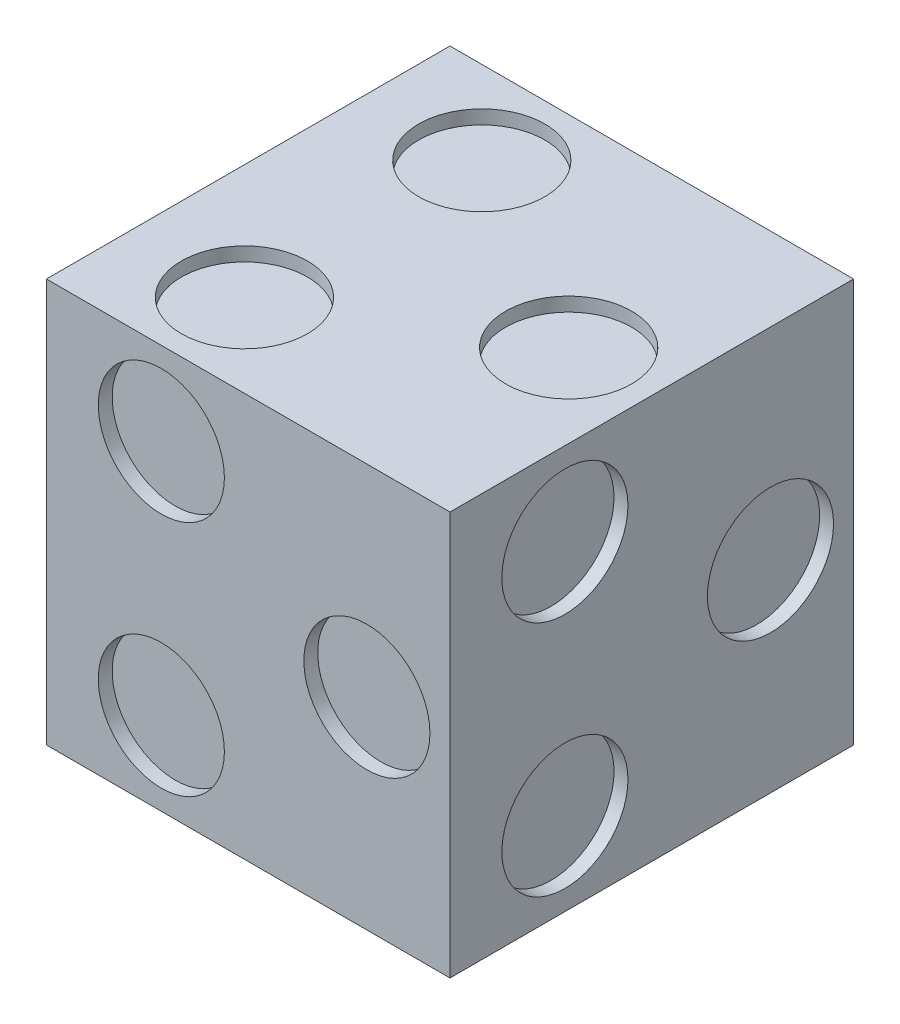
ISO-10303-21;
HEADER;
FILE_DESCRIPTION(('STEP AP214'),'2;1');
FILE_NAME('part.step','',(''),(''),'','','');
FILE_SCHEMA(('AUTOMOTIVE_DESIGN { 1 0 10303 214 1 1 1 1 }'));
ENDSEC;
DATA;
#1=APPLICATION_CONTEXT('core data for automotive mechanical design processes');
#2=APPLICATION_PROTOCOL_DEFINITION('international standard','automotive_design',2000,#1);
#3=PRODUCT_CONTEXT('',#1,'mechanical');
#4=PRODUCT('Part','Part','',(#3));
#5=PRODUCT_RELATED_PRODUCT_CATEGORY('part','',(#4));
#6=PRODUCT_DEFINITION_FORMATION('','',#4);
#7=PRODUCT_DEFINITION_CONTEXT('part definition',#1,'design');
#8=PRODUCT_DEFINITION('design','',#6,#7);
#9=PRODUCT_DEFINITION_SHAPE('','',#8);
#10=(LENGTH_UNIT() NAMED_UNIT(*) SI_UNIT(.MILLI.,.METRE.));
#11=(NAMED_UNIT(*) PLANE_ANGLE_UNIT() SI_UNIT($,.RADIAN.));
#12=(NAMED_UNIT(*) SI_UNIT($,.STERADIAN.) SOLID_ANGLE_UNIT());
#13=UNCERTAINTY_MEASURE_WITH_UNIT(LENGTH_MEASURE(1.E-05),#10,'distance_accuracy_value','');
#14=(GEOMETRIC_REPRESENTATION_CONTEXT(3) GLOBAL_UNCERTAINTY_ASSIGNED_CONTEXT((#13)) GLOBAL_UNIT_ASSIGNED_CONTEXT((#10,
#11,#12)) REPRESENTATION_CONTEXT('',''));
#15=CARTESIAN_POINT('',(0.,0.,0.));
#16=DIRECTION('',(0.,0.,1.));
#17=DIRECTION('',(1.,0.,0.));
#18=AXIS2_PLACEMENT_3D('',#15,#16,#17);
#19=CARTESIAN_POINT('',(0.,101.6,0.));
#20=DIRECTION('',(1.,0.,0.));
#21=DIRECTION('',(0.,0.,-1.));
#22=AXIS2_PLACEMENT_3D('',#19,#20,#21);
#23=PLANE('',#22);
#24=CARTESIAN_POINT('',(0.,50.8,-20.9221235694369));
#25=DIRECTION('',(-1.,0.,0.));
#26=DIRECTION('',(0.,0.,1.));
#27=AXIS2_PLACEMENT_3D('',#24,#25,#26);
#28=CIRCLE('',#27,15.875);
#29=CARTESIAN_POINT('',(0.,50.8,-5.04712356943687));
#30=VERTEX_POINT('',#29);
#31=EDGE_CURVE('E138',#30,#30,#28,.T.);
#32=ORIENTED_EDGE('',*,*,#31,.F.);
#33=EDGE_LOOP('',(#32));
#34=FACE_BOUND('',#33,.T.);
#35=CARTESIAN_POINT('',(0.,80.6778764305631,-72.6721235694368));
#36=DIRECTION('',(-1.,0.,0.));
#37=DIRECTION('',(0.,0.,1.));
#38=AXIS2_PLACEMENT_3D('',#35,#36,#37);
#39=CIRCLE('',#38,15.875);
#40=CARTESIAN_POINT('',(0.,80.6778764305631,-56.7971235694369));
#41=VERTEX_POINT('',#40);
#42=EDGE_CURVE('E145',#41,#41,#39,.T.);
#43=ORIENTED_EDGE('',*,*,#42,.F.);
#44=EDGE_LOOP('',(#43));
#45=FACE_BOUND('',#44,.T.);
#46=CARTESIAN_POINT('',(0.,20.9221235694369,-72.6721235694369));
#47=DIRECTION('',(-1.,0.,0.));
#48=DIRECTION('',(0.,0.,1.));
#49=AXIS2_PLACEMENT_3D('',#46,#47,#48);
#50=CIRCLE('',#49,15.875);
#51=CARTESIAN_POINT('',(0.,20.9221235694369,-56.7971235694369));
#52=VERTEX_POINT('',#51);
#53=EDGE_CURVE('E132',#52,#52,#50,.T.);
#54=ORIENTED_EDGE('',*,*,#53,.F.);
#55=EDGE_LOOP('',(#54));
#56=FACE_BOUND('',#55,.T.);
#57=DIRECTION('',(0.,0.,1.));
#58=VECTOR('',#57,1.);
#59=CARTESIAN_POINT('',(0.,0.,0.));
#60=LINE('',#59,#58);
#61=CARTESIAN_POINT('',(0.,0.,-101.6));
#62=VERTEX_POINT('',#61);
#63=CARTESIAN_POINT('',(0.,0.,0.));
#64=VERTEX_POINT('',#63);
#65=EDGE_CURVE('E100',#62,#64,#60,.T.);
#66=ORIENTED_EDGE('',*,*,#65,.T.);
#67=DIRECTION('',(0.,-1.,0.));
#68=VECTOR('',#67,1.);
#69=CARTESIAN_POINT('',(0.,101.6,0.));
#70=LINE('',#69,#68);
#71=CARTESIAN_POINT('',(0.,101.6,0.));
#72=VERTEX_POINT('',#71);
#73=EDGE_CURVE('E11',#72,#64,#70,.T.);
#74=ORIENTED_EDGE('',*,*,#73,.F.);
#75=DIRECTION('',(0.,0.,1.));
#76=VECTOR('',#75,1.);
#77=CARTESIAN_POINT('',(0.,101.6,0.));
#78=LINE('',#77,#76);
#79=CARTESIAN_POINT('',(0.,101.6,-101.6));
#80=VERTEX_POINT('',#79);
#81=EDGE_CURVE('E88',#80,#72,#78,.T.);
#82=ORIENTED_EDGE('',*,*,#81,.F.);
#83=DIRECTION('',(0.,-1.,0.));
#84=VECTOR('',#83,1.);
#85=CARTESIAN_POINT('',(0.,101.6,-101.6));
#86=LINE('',#85,#84);
#87=EDGE_CURVE('E96',#80,#62,#86,.T.);
#88=ORIENTED_EDGE('',*,*,#87,.T.);
#89=EDGE_LOOP('',(#66,#74,#82,#88));
#90=FACE_BOUND('',#89,.T.);
#91=ADVANCED_FACE('F37',(#34,#45,#56,#90),#23,.F.);
#92=CARTESIAN_POINT('',(0.,101.6,0.));
#93=DIRECTION('',(0.,0.,-1.));
#94=DIRECTION('',(-1.,0.,0.));
#95=AXIS2_PLACEMENT_3D('',#92,#93,#94);
#96=PLANE('',#95);
#97=CARTESIAN_POINT('',(80.6778764305631,50.8,0.));
#98=DIRECTION('',(0.,0.,1.));
#99=DIRECTION('',(1.,0.,0.));
#100=AXIS2_PLACEMENT_3D('',#97,#98,#99);
#101=CIRCLE('',#100,15.875);
#102=CARTESIAN_POINT('',(96.5528764305631,50.8,0.));
#103=VERTEX_POINT('',#102);
#104=EDGE_CURVE('E192',#103,#103,#101,.T.);
#105=ORIENTED_EDGE('',*,*,#104,.F.);
#106=EDGE_LOOP('',(#105));
#107=FACE_BOUND('',#106,.T.);
#108=CARTESIAN_POINT('',(28.9278764305631,80.6778764305631,0.));
#109=DIRECTION('',(0.,0.,1.));
#110=DIRECTION('',(1.,0.,0.));
#111=AXIS2_PLACEMENT_3D('',#108,#109,#110);
#112=CIRCLE('',#111,15.875);
#113=CARTESIAN_POINT('',(44.8028764305631,80.6778764305631,0.));
#114=VERTEX_POINT('',#113);
#115=EDGE_CURVE('E199',#114,#114,#112,.T.);
#116=ORIENTED_EDGE('',*,*,#115,.F.);
#117=EDGE_LOOP('',(#116));
#118=FACE_BOUND('',#117,.T.);
#119=CARTESIAN_POINT('',(28.9278764305631,20.9221235694368,0.));
#120=DIRECTION('',(0.,0.,1.));
#121=DIRECTION('',(1.,0.,0.));
#122=AXIS2_PLACEMENT_3D('',#119,#120,#121);
#123=CIRCLE('',#122,15.875);
#124=CARTESIAN_POINT('',(44.8028764305631,20.9221235694368,0.));
#125=VERTEX_POINT('',#124);
#126=EDGE_CURVE('E186',#125,#125,#123,.T.);
#127=ORIENTED_EDGE('',*,*,#126,.F.);
#128=EDGE_LOOP('',(#127));
#129=FACE_BOUND('',#128,.T.);
#130=DIRECTION('',(1.,0.,0.));
#131=VECTOR('',#130,1.);
#132=CARTESIAN_POINT('',(0.,0.,0.));
#133=LINE('',#132,#131);
#134=CARTESIAN_POINT('',(101.6,0.,0.));
#135=VERTEX_POINT('',#134);
#136=EDGE_CURVE('E92',#64,#135,#133,.T.);
#137=ORIENTED_EDGE('',*,*,#136,.T.);
#138=DIRECTION('',(0.,-1.,0.));
#139=VECTOR('',#138,1.);
#140=CARTESIAN_POINT('',(101.6,101.6,0.));
#141=LINE('',#140,#139);
#142=CARTESIAN_POINT('',(101.6,101.6,0.));
#143=VERTEX_POINT('',#142);
#144=EDGE_CURVE('E45',#143,#135,#141,.T.);
#145=ORIENTED_EDGE('',*,*,#144,.F.);
#146=DIRECTION('',(1.,0.,0.));
#147=VECTOR('',#146,1.);
#148=CARTESIAN_POINT('',(0.,101.6,0.));
#149=LINE('',#148,#147);
#150=EDGE_CURVE('E83',#72,#143,#149,.T.);
#151=ORIENTED_EDGE('',*,*,#150,.F.);
#152=ORIENTED_EDGE('',*,*,#73,.T.);
#153=EDGE_LOOP('',(#137,#145,#151,#152));
#154=FACE_BOUND('',#153,.T.);
#155=ADVANCED_FACE('F91',(#107,#118,#129,#154),#96,.F.);
#156=CARTESIAN_POINT('',(101.6,101.6,0.));
#157=DIRECTION('',(-1.,0.,0.));
#158=DIRECTION('',(0.,0.,1.));
#159=AXIS2_PLACEMENT_3D('',#156,#157,#158);
#160=PLANE('',#159);
#161=CARTESIAN_POINT('',(101.6,50.8,-80.6778764305631));
#162=DIRECTION('',(1.,0.,0.));
#163=DIRECTION('',(0.,0.,-1.));
#164=AXIS2_PLACEMENT_3D('',#161,#162,#163);
#165=CIRCLE('',#164,15.875);
#166=CARTESIAN_POINT('',(101.6,50.8,-96.5528764305631));
#167=VERTEX_POINT('',#166);
#168=EDGE_CURVE('E174',#167,#167,#165,.T.);
#169=ORIENTED_EDGE('',*,*,#168,.F.);
#170=EDGE_LOOP('',(#169));
#171=FACE_BOUND('',#170,.T.);
#172=CARTESIAN_POINT('',(101.6,80.6778764305631,-28.9278764305631));
#173=DIRECTION('',(1.,0.,0.));
#174=DIRECTION('',(0.,0.,-1.));
#175=AXIS2_PLACEMENT_3D('',#172,#173,#174);
#176=CIRCLE('',#175,15.875);
#177=CARTESIAN_POINT('',(101.6,80.6778764305631,-44.8028764305632));
#178=VERTEX_POINT('',#177);
#179=EDGE_CURVE('E181',#178,#178,#176,.T.);
#180=ORIENTED_EDGE('',*,*,#179,.F.);
#181=EDGE_LOOP('',(#180));
#182=FACE_BOUND('',#181,.T.);
#183=CARTESIAN_POINT('',(101.6,20.9221235694369,-28.9278764305631));
#184=DIRECTION('',(1.,0.,0.));
#185=DIRECTION('',(0.,0.,-1.));
#186=AXIS2_PLACEMENT_3D('',#183,#184,#185);
#187=CIRCLE('',#186,15.875);
#188=CARTESIAN_POINT('',(101.6,20.9221235694369,-44.8028764305632));
#189=VERTEX_POINT('',#188);
#190=EDGE_CURVE('E168',#189,#189,#187,.T.);
#191=ORIENTED_EDGE('',*,*,#190,.F.);
#192=EDGE_LOOP('',(#191));
#193=FACE_BOUND('',#192,.T.);
#194=DIRECTION('',(0.,0.,-1.));
#195=VECTOR('',#194,1.);
#196=CARTESIAN_POINT('',(101.6,0.,0.));
#197=LINE('',#196,#195);
#198=CARTESIAN_POINT('',(101.6,0.,-101.6));
#199=VERTEX_POINT('',#198);
#200=EDGE_CURVE('E70',#135,#199,#197,.T.);
#201=ORIENTED_EDGE('',*,*,#200,.T.);
#202=DIRECTION('',(0.,-1.,0.));
#203=VECTOR('',#202,1.);
#204=CARTESIAN_POINT('',(101.6,101.6,-101.6));
#205=LINE('',#204,#203);
#206=CARTESIAN_POINT('',(101.6,101.6,-101.6));
#207=VERTEX_POINT('',#206);
#208=EDGE_CURVE('E93',#207,#199,#205,.T.);
#209=ORIENTED_EDGE('',*,*,#208,.F.);
#210=DIRECTION('',(0.,0.,-1.));
#211=VECTOR('',#210,1.);
#212=CARTESIAN_POINT('',(101.6,101.6,0.));
#213=LINE('',#212,#211);
#214=EDGE_CURVE('E86',#143,#207,#213,.T.);
#215=ORIENTED_EDGE('',*,*,#214,.F.);
#216=ORIENTED_EDGE('',*,*,#144,.T.);
#217=EDGE_LOOP('',(#201,#209,#215,#216));
#218=FACE_BOUND('',#217,.T.);
#219=ADVANCED_FACE('F94',(#171,#182,#193,#218),#160,.F.);
#220=CARTESIAN_POINT('',(0.,101.6,-101.6));
#221=DIRECTION('',(0.,0.,1.));
#222=DIRECTION('',(1.,0.,0.));
#223=AXIS2_PLACEMENT_3D('',#220,#221,#222);
#224=PLANE('',#223);
#225=CARTESIAN_POINT('',(20.9221235694369,50.8,-101.6));
#226=DIRECTION('',(0.,0.,-1.));
#227=DIRECTION('',(-1.,0.,0.));
#228=AXIS2_PLACEMENT_3D('',#225,#226,#227);
#229=CIRCLE('',#228,15.875);
#230=CARTESIAN_POINT('',(5.04712356943688,50.8,-101.6));
#231=VERTEX_POINT('',#230);
#232=EDGE_CURVE('E156',#231,#231,#229,.T.);
#233=ORIENTED_EDGE('',*,*,#232,.F.);
#234=EDGE_LOOP('',(#233));
#235=FACE_BOUND('',#234,.T.);
#236=CARTESIAN_POINT('',(72.6721235694369,80.6778764305631,-101.6));
#237=DIRECTION('',(0.,0.,-1.));
#238=DIRECTION('',(-1.,0.,0.));
#239=AXIS2_PLACEMENT_3D('',#236,#237,#238);
#240=CIRCLE('',#239,15.875);
#241=CARTESIAN_POINT('',(56.7971235694369,80.6778764305631,-101.6));
#242=VERTEX_POINT('',#241);
#243=EDGE_CURVE('E163',#242,#242,#240,.T.);
#244=ORIENTED_EDGE('',*,*,#243,.F.);
#245=EDGE_LOOP('',(#244));
#246=FACE_BOUND('',#245,.T.);
#247=CARTESIAN_POINT('',(72.6721235694369,20.9221235694369,-101.6));
#248=DIRECTION('',(0.,0.,-1.));
#249=DIRECTION('',(-1.,0.,0.));
#250=AXIS2_PLACEMENT_3D('',#247,#248,#249);
#251=CIRCLE('',#250,15.875);
#252=CARTESIAN_POINT('',(56.7971235694369,20.9221235694369,-101.6));
#253=VERTEX_POINT('',#252);
#254=EDGE_CURVE('E150',#253,#253,#251,.T.);
#255=ORIENTED_EDGE('',*,*,#254,.F.);
#256=EDGE_LOOP('',(#255));
#257=FACE_BOUND('',#256,.T.);
#258=DIRECTION('',(-1.,0.,0.));
#259=VECTOR('',#258,1.);
#260=CARTESIAN_POINT('',(0.,0.,-101.6));
#261=LINE('',#260,#259);
#262=EDGE_CURVE('E76',#199,#62,#261,.T.);
#263=ORIENTED_EDGE('',*,*,#262,.T.);
#264=ORIENTED_EDGE('',*,*,#87,.F.);
#265=DIRECTION('',(-1.,0.,0.));
#266=VECTOR('',#265,1.);
#267=CARTESIAN_POINT('',(0.,101.6,-101.6));
#268=LINE('',#267,#266);
#269=EDGE_CURVE('E53',#207,#80,#268,.T.);
#270=ORIENTED_EDGE('',*,*,#269,.F.);
#271=ORIENTED_EDGE('',*,*,#208,.T.);
#272=EDGE_LOOP('',(#263,#264,#270,#271));
#273=FACE_BOUND('',#272,.T.);
#274=ADVANCED_FACE('F108',(#235,#246,#257,#273),#224,.F.);
#275=CARTESIAN_POINT('',(0.,101.6,0.));
#276=DIRECTION('',(0.,-1.,0.));
#277=DIRECTION('',(0.,0.,-1.));
#278=AXIS2_PLACEMENT_3D('',#275,#276,#277);
#279=PLANE('',#278);
#280=CARTESIAN_POINT('',(80.6778764305631,101.6,-50.8));
#281=DIRECTION('',(0.,1.,0.));
#282=DIRECTION('',(0.,0.,1.));
#283=AXIS2_PLACEMENT_3D('',#280,#281,#282);
#284=CIRCLE('',#283,15.875);
#285=CARTESIAN_POINT('',(80.6778764305631,101.6,-34.925));
#286=VERTEX_POINT('',#285);
#287=EDGE_CURVE('E120',#286,#286,#284,.T.);
#288=ORIENTED_EDGE('',*,*,#287,.F.);
#289=EDGE_LOOP('',(#288));
#290=FACE_BOUND('',#289,.T.);
#291=CARTESIAN_POINT('',(28.9278764305631,101.6,-80.6778764305631));
#292=DIRECTION('',(0.,1.,0.));
#293=DIRECTION('',(0.,0.,1.));
#294=AXIS2_PLACEMENT_3D('',#291,#292,#293);
#295=CIRCLE('',#294,15.875);
#296=CARTESIAN_POINT('',(28.9278764305631,101.6,-64.8028764305631));
#297=VERTEX_POINT('',#296);
#298=EDGE_CURVE('E127',#297,#297,#295,.T.);
#299=ORIENTED_EDGE('',*,*,#298,.F.);
#300=EDGE_LOOP('',(#299));
#301=FACE_BOUND('',#300,.T.);
#302=CARTESIAN_POINT('',(28.9278764305631,101.6,-20.9221235694369));
#303=DIRECTION('',(0.,1.,0.));
#304=DIRECTION('',(0.,0.,1.));
#305=AXIS2_PLACEMENT_3D('',#302,#303,#304);
#306=CIRCLE('',#305,15.875);
#307=CARTESIAN_POINT('',(28.9278764305631,101.6,-5.04712356943686));
#308=VERTEX_POINT('',#307);
#309=EDGE_CURVE('E114',#308,#308,#306,.T.);
#310=ORIENTED_EDGE('',*,*,#309,.F.);
#311=EDGE_LOOP('',(#310));
#312=FACE_BOUND('',#311,.T.);
#313=ORIENTED_EDGE('',*,*,#81,.T.);
#314=ORIENTED_EDGE('',*,*,#150,.T.);
#315=ORIENTED_EDGE('',*,*,#214,.T.);
#316=ORIENTED_EDGE('',*,*,#269,.T.);
#317=EDGE_LOOP('',(#313,#314,#315,#316));
#318=FACE_BOUND('',#317,.T.);
#319=ADVANCED_FACE('F84',(#290,#301,#312,#318),#279,.F.);
#320=CARTESIAN_POINT('',(0.,0.,0.));
#321=DIRECTION('',(0.,-1.,0.));
#322=DIRECTION('',(0.,0.,-1.));
#323=AXIS2_PLACEMENT_3D('',#320,#321,#322);
#324=PLANE('',#323);
#325=CARTESIAN_POINT('',(20.9221235694369,0.,-50.8));
#326=DIRECTION('',(0.,-1.,0.));
#327=DIRECTION('',(0.,0.,-1.));
#328=AXIS2_PLACEMENT_3D('',#325,#326,#327);
#329=CIRCLE('',#328,15.875);
#330=CARTESIAN_POINT('',(20.9221235694369,0.,-66.675));
#331=VERTEX_POINT('',#330);
#332=EDGE_CURVE('E210',#331,#331,#329,.T.);
#333=ORIENTED_EDGE('',*,*,#332,.F.);
#334=EDGE_LOOP('',(#333));
#335=FACE_BOUND('',#334,.T.);
#336=CARTESIAN_POINT('',(72.6721235694369,0.,-80.6778764305631));
#337=DIRECTION('',(0.,-1.,0.));
#338=DIRECTION('',(0.,0.,-1.));
#339=AXIS2_PLACEMENT_3D('',#336,#337,#338);
#340=CIRCLE('',#339,15.875);
#341=CARTESIAN_POINT('',(72.6721235694369,0.,-96.5528764305631));
#342=VERTEX_POINT('',#341);
#343=EDGE_CURVE('E216',#342,#342,#340,.T.);
#344=ORIENTED_EDGE('',*,*,#343,.F.);
#345=EDGE_LOOP('',(#344));
#346=FACE_BOUND('',#345,.T.);
#347=CARTESIAN_POINT('',(72.6721235694369,0.,-20.9221235694369));
#348=DIRECTION('',(0.,-1.,0.));
#349=DIRECTION('',(0.,0.,-1.));
#350=AXIS2_PLACEMENT_3D('',#347,#348,#349);
#351=CIRCLE('',#350,15.875);
#352=CARTESIAN_POINT('',(72.6721235694369,0.,-36.7971235694369));
#353=VERTEX_POINT('',#352);
#354=EDGE_CURVE('E204',#353,#353,#351,.T.);
#355=ORIENTED_EDGE('',*,*,#354,.F.);
#356=EDGE_LOOP('',(#355));
#357=FACE_BOUND('',#356,.T.);
#358=ORIENTED_EDGE('',*,*,#65,.F.);
#359=ORIENTED_EDGE('',*,*,#262,.F.);
#360=ORIENTED_EDGE('',*,*,#200,.F.);
#361=ORIENTED_EDGE('',*,*,#136,.F.);
#362=EDGE_LOOP('',(#358,#359,#360,#361));
#363=FACE_BOUND('',#362,.T.);
#364=ADVANCED_FACE('F111',(#335,#346,#357,#363),#324,.T.);
#365=CARTESIAN_POINT('',(28.9278764305631,98.099999888,-20.9221235694369));
#366=DIRECTION('',(0.,1.,0.));
#367=DIRECTION('',(0.,0.,1.));
#368=AXIS2_PLACEMENT_3D('',#365,#366,#367);
#369=CYLINDRICAL_SURFACE('',#368,15.875);
#370=CARTESIAN_POINT('',(28.9278764305631,98.099999888,-20.9221235694369));
#371=DIRECTION('',(0.,1.,0.));
#372=DIRECTION('',(0.,0.,1.));
#373=AXIS2_PLACEMENT_3D('',#370,#371,#372);
#374=CIRCLE('',#373,15.875);
#375=CARTESIAN_POINT('',(28.9278764305631,98.099999888,-5.04712356943686));
#376=VERTEX_POINT('',#375);
#377=EDGE_CURVE('E103',#376,#376,#374,.T.);
#378=ORIENTED_EDGE('',*,*,#377,.F.);
#379=EDGE_LOOP('',(#378));
#380=FACE_BOUND('',#379,.T.);
#381=ORIENTED_EDGE('',*,*,#309,.T.);
#382=EDGE_LOOP('',(#381));
#383=FACE_BOUND('',#382,.T.);
#384=ADVANCED_FACE('F233',(#380,#383),#369,.F.);
#385=CARTESIAN_POINT('',(28.9278764305631,98.099999888,-20.9221235694369));
#386=DIRECTION('',(0.,1.,0.));
#387=DIRECTION('',(0.,0.,1.));
#388=AXIS2_PLACEMENT_3D('',#385,#386,#387);
#389=PLANE('',#388);
#390=ORIENTED_EDGE('',*,*,#377,.T.);
#391=EDGE_LOOP('',(#390));
#392=FACE_BOUND('',#391,.T.);
#393=ADVANCED_FACE('F291',(#392),#389,.T.);
#394=CARTESIAN_POINT('',(28.9278764305631,98.099999888,-80.6778764305631));
#395=DIRECTION('',(0.,1.,0.));
#396=DIRECTION('',(0.,0.,1.));
#397=AXIS2_PLACEMENT_3D('',#394,#395,#396);
#398=CYLINDRICAL_SURFACE('',#397,15.875);
#399=CARTESIAN_POINT('',(28.9278764305631,98.099999888,-80.6778764305631));
#400=DIRECTION('',(0.,1.,0.));
#401=DIRECTION('',(0.,0.,1.));
#402=AXIS2_PLACEMENT_3D('',#399,#400,#401);
#403=CIRCLE('',#402,15.875);
#404=CARTESIAN_POINT('',(28.9278764305631,98.099999888,-64.8028764305631));
#405=VERTEX_POINT('',#404);
#406=EDGE_CURVE('E117',#405,#405,#403,.T.);
#407=ORIENTED_EDGE('',*,*,#406,.F.);
#408=EDGE_LOOP('',(#407));
#409=FACE_BOUND('',#408,.T.);
#410=ORIENTED_EDGE('',*,*,#298,.T.);
#411=EDGE_LOOP('',(#410));
#412=FACE_BOUND('',#411,.T.);
#413=ADVANCED_FACE('F288',(#409,#412),#398,.F.);
#414=CARTESIAN_POINT('',(28.9278764305631,98.099999888,-80.6778764305631));
#415=DIRECTION('',(0.,1.,0.));
#416=DIRECTION('',(0.,0.,1.));
#417=AXIS2_PLACEMENT_3D('',#414,#415,#416);
#418=PLANE('',#417);
#419=ORIENTED_EDGE('',*,*,#406,.T.);
#420=EDGE_LOOP('',(#419));
#421=FACE_BOUND('',#420,.T.);
#422=ADVANCED_FACE('F285',(#421),#418,.T.);
#423=CARTESIAN_POINT('',(80.6778764305631,98.099999888,-50.8));
#424=DIRECTION('',(0.,1.,0.));
#425=DIRECTION('',(0.,0.,1.));
#426=AXIS2_PLACEMENT_3D('',#423,#424,#425);
#427=CYLINDRICAL_SURFACE('',#426,15.875);
#428=CARTESIAN_POINT('',(80.6778764305631,98.099999888,-50.8));
#429=DIRECTION('',(0.,1.,0.));
#430=DIRECTION('',(0.,0.,1.));
#431=AXIS2_PLACEMENT_3D('',#428,#429,#430);
#432=CIRCLE('',#431,15.875);
#433=CARTESIAN_POINT('',(80.6778764305631,98.099999888,-34.925));
#434=VERTEX_POINT('',#433);
#435=EDGE_CURVE('E123',#434,#434,#432,.T.);
#436=ORIENTED_EDGE('',*,*,#435,.F.);
#437=EDGE_LOOP('',(#436));
#438=FACE_BOUND('',#437,.T.);
#439=ORIENTED_EDGE('',*,*,#287,.T.);
#440=EDGE_LOOP('',(#439));
#441=FACE_BOUND('',#440,.T.);
#442=ADVANCED_FACE('F279',(#438,#441),#427,.F.);
#443=CARTESIAN_POINT('',(80.6778764305631,98.099999888,-50.8));
#444=DIRECTION('',(0.,1.,0.));
#445=DIRECTION('',(0.,0.,1.));
#446=AXIS2_PLACEMENT_3D('',#443,#444,#445);
#447=PLANE('',#446);
#448=ORIENTED_EDGE('',*,*,#435,.T.);
#449=EDGE_LOOP('',(#448));
#450=FACE_BOUND('',#449,.T.);
#451=ADVANCED_FACE('F269',(#450),#447,.T.);
#452=CARTESIAN_POINT('',(3.500000112,20.9221235694369,-72.6721235694369));
#453=DIRECTION('',(-1.,0.,0.));
#454=DIRECTION('',(0.,0.,1.));
#455=AXIS2_PLACEMENT_3D('',#452,#453,#454);
#456=CYLINDRICAL_SURFACE('',#455,15.875);
#457=CARTESIAN_POINT('',(3.500000112,20.9221235694369,-72.6721235694369));
#458=DIRECTION('',(-1.,0.,0.));
#459=DIRECTION('',(0.,0.,1.));
#460=AXIS2_PLACEMENT_3D('',#457,#458,#459);
#461=CIRCLE('',#460,15.875);
#462=CARTESIAN_POINT('',(3.500000112,20.9221235694369,-56.7971235694369));
#463=VERTEX_POINT('',#462);
#464=EDGE_CURVE('E124',#463,#463,#461,.T.);
#465=ORIENTED_EDGE('',*,*,#464,.F.);
#466=EDGE_LOOP('',(#465));
#467=FACE_BOUND('',#466,.T.);
#468=ORIENTED_EDGE('',*,*,#53,.T.);
#469=EDGE_LOOP('',(#468));
#470=FACE_BOUND('',#469,.T.);
#471=ADVANCED_FACE('F266',(#467,#470),#456,.F.);
#472=CARTESIAN_POINT('',(3.500000112,20.9221235694369,-72.6721235694369));
#473=DIRECTION('',(-1.,0.,0.));
#474=DIRECTION('',(0.,0.,1.));
#475=AXIS2_PLACEMENT_3D('',#472,#473,#474);
#476=PLANE('',#475);
#477=ORIENTED_EDGE('',*,*,#464,.T.);
#478=EDGE_LOOP('',(#477));
#479=FACE_BOUND('',#478,.T.);
#480=ADVANCED_FACE('F268',(#479),#476,.T.);
#481=CARTESIAN_POINT('',(3.500000112,80.6778764305631,-72.6721235694368));
#482=DIRECTION('',(-1.,0.,0.));
#483=DIRECTION('',(0.,0.,1.));
#484=AXIS2_PLACEMENT_3D('',#481,#482,#483);
#485=CYLINDRICAL_SURFACE('',#484,15.875);
#486=CARTESIAN_POINT('',(3.500000112,80.6778764305631,-72.6721235694368));
#487=DIRECTION('',(-1.,0.,0.));
#488=DIRECTION('',(0.,0.,1.));
#489=AXIS2_PLACEMENT_3D('',#486,#487,#488);
#490=CIRCLE('',#489,15.875);
#491=CARTESIAN_POINT('',(3.500000112,80.6778764305631,-56.7971235694369));
#492=VERTEX_POINT('',#491);
#493=EDGE_CURVE('E135',#492,#492,#490,.T.);
#494=ORIENTED_EDGE('',*,*,#493,.F.);
#495=EDGE_LOOP('',(#494));
#496=FACE_BOUND('',#495,.T.);
#497=ORIENTED_EDGE('',*,*,#42,.T.);
#498=EDGE_LOOP('',(#497));
#499=FACE_BOUND('',#498,.T.);
#500=ADVANCED_FACE('F276',(#496,#499),#485,.F.);
#501=CARTESIAN_POINT('',(3.500000112,80.6778764305631,-72.6721235694368));
#502=DIRECTION('',(-1.,0.,0.));
#503=DIRECTION('',(0.,0.,1.));
#504=AXIS2_PLACEMENT_3D('',#501,#502,#503);
#505=PLANE('',#504);
#506=ORIENTED_EDGE('',*,*,#493,.T.);
#507=EDGE_LOOP('',(#506));
#508=FACE_BOUND('',#507,.T.);
#509=ADVANCED_FACE('F358',(#508),#505,.T.);
#510=CARTESIAN_POINT('',(3.500000112,50.8,-20.9221235694369));
#511=DIRECTION('',(-1.,0.,0.));
#512=DIRECTION('',(0.,0.,1.));
#513=AXIS2_PLACEMENT_3D('',#510,#511,#512);
#514=CYLINDRICAL_SURFACE('',#513,15.875);
#515=CARTESIAN_POINT('',(3.500000112,50.8,-20.9221235694369));
#516=DIRECTION('',(-1.,0.,0.));
#517=DIRECTION('',(0.,0.,1.));
#518=AXIS2_PLACEMENT_3D('',#515,#516,#517);
#519=CIRCLE('',#518,15.875);
#520=CARTESIAN_POINT('',(3.500000112,50.8,-5.04712356943687));
#521=VERTEX_POINT('',#520);
#522=EDGE_CURVE('E141',#521,#521,#519,.T.);
#523=ORIENTED_EDGE('',*,*,#522,.F.);
#524=EDGE_LOOP('',(#523));
#525=FACE_BOUND('',#524,.T.);
#526=ORIENTED_EDGE('',*,*,#31,.T.);
#527=EDGE_LOOP('',(#526));
#528=FACE_BOUND('',#527,.T.);
#529=ADVANCED_FACE('F361',(#525,#528),#514,.F.);
#530=CARTESIAN_POINT('',(3.500000112,50.8,-20.9221235694369));
#531=DIRECTION('',(-1.,0.,0.));
#532=DIRECTION('',(0.,0.,1.));
#533=AXIS2_PLACEMENT_3D('',#530,#531,#532);
#534=PLANE('',#533);
#535=ORIENTED_EDGE('',*,*,#522,.T.);
#536=EDGE_LOOP('',(#535));
#537=FACE_BOUND('',#536,.T.);
#538=ADVANCED_FACE('F356',(#537),#534,.T.);
#539=CARTESIAN_POINT('',(72.6721235694369,20.9221235694369,-98.099999888));
#540=DIRECTION('',(0.,0.,-1.));
#541=DIRECTION('',(-1.,0.,0.));
#542=AXIS2_PLACEMENT_3D('',#539,#540,#541);
#543=CYLINDRICAL_SURFACE('',#542,15.875);
#544=CARTESIAN_POINT('',(72.6721235694369,20.9221235694369,-98.099999888));
#545=DIRECTION('',(0.,0.,-1.));
#546=DIRECTION('',(-1.,0.,0.));
#547=AXIS2_PLACEMENT_3D('',#544,#545,#546);
#548=CIRCLE('',#547,15.875);
#549=CARTESIAN_POINT('',(56.7971235694369,20.9221235694369,-98.099999888));
#550=VERTEX_POINT('',#549);
#551=EDGE_CURVE('E142',#550,#550,#548,.T.);
#552=ORIENTED_EDGE('',*,*,#551,.F.);
#553=EDGE_LOOP('',(#552));
#554=FACE_BOUND('',#553,.T.);
#555=ORIENTED_EDGE('',*,*,#254,.T.);
#556=EDGE_LOOP('',(#555));
#557=FACE_BOUND('',#556,.T.);
#558=ADVANCED_FACE('F352',(#554,#557),#543,.F.);
#559=CARTESIAN_POINT('',(72.6721235694369,20.9221235694369,-98.099999888));
#560=DIRECTION('',(0.,0.,-1.));
#561=DIRECTION('',(-1.,0.,0.));
#562=AXIS2_PLACEMENT_3D('',#559,#560,#561);
#563=PLANE('',#562);
#564=ORIENTED_EDGE('',*,*,#551,.T.);
#565=EDGE_LOOP('',(#564));
#566=FACE_BOUND('',#565,.T.);
#567=ADVANCED_FACE('F344',(#566),#563,.T.);
#568=CARTESIAN_POINT('',(72.6721235694369,80.6778764305631,-98.099999888));
#569=DIRECTION('',(0.,0.,-1.));
#570=DIRECTION('',(-1.,0.,0.));
#571=AXIS2_PLACEMENT_3D('',#568,#569,#570);
#572=CYLINDRICAL_SURFACE('',#571,15.875);
#573=CARTESIAN_POINT('',(72.6721235694369,80.6778764305631,-98.099999888));
#574=DIRECTION('',(0.,0.,-1.));
#575=DIRECTION('',(-1.,0.,0.));
#576=AXIS2_PLACEMENT_3D('',#573,#574,#575);
#577=CIRCLE('',#576,15.875);
#578=CARTESIAN_POINT('',(56.7971235694369,80.6778764305631,-98.099999888));
#579=VERTEX_POINT('',#578);
#580=EDGE_CURVE('E153',#579,#579,#577,.T.);
#581=ORIENTED_EDGE('',*,*,#580,.F.);
#582=EDGE_LOOP('',(#581));
#583=FACE_BOUND('',#582,.T.);
#584=ORIENTED_EDGE('',*,*,#243,.T.);
#585=EDGE_LOOP('',(#584));
#586=FACE_BOUND('',#585,.T.);
#587=ADVANCED_FACE('F341',(#583,#586),#572,.F.);
#588=CARTESIAN_POINT('',(72.6721235694369,80.6778764305631,-98.099999888));
#589=DIRECTION('',(0.,0.,-1.));
#590=DIRECTION('',(-1.,0.,0.));
#591=AXIS2_PLACEMENT_3D('',#588,#589,#590);
#592=PLANE('',#591);
#593=ORIENTED_EDGE('',*,*,#580,.T.);
#594=EDGE_LOOP('',(#593));
#595=FACE_BOUND('',#594,.T.);
#596=ADVANCED_FACE('F338',(#595),#592,.T.);
#597=CARTESIAN_POINT('',(20.9221235694369,50.8,-98.099999888));
#598=DIRECTION('',(0.,0.,-1.));
#599=DIRECTION('',(-1.,0.,0.));
#600=AXIS2_PLACEMENT_3D('',#597,#598,#599);
#601=CYLINDRICAL_SURFACE('',#600,15.875);
#602=CARTESIAN_POINT('',(20.9221235694369,50.8,-98.099999888));
#603=DIRECTION('',(0.,0.,-1.));
#604=DIRECTION('',(-1.,0.,0.));
#605=AXIS2_PLACEMENT_3D('',#602,#603,#604);
#606=CIRCLE('',#605,15.875);
#607=CARTESIAN_POINT('',(5.04712356943688,50.8,-98.099999888));
#608=VERTEX_POINT('',#607);
#609=EDGE_CURVE('E159',#608,#608,#606,.T.);
#610=ORIENTED_EDGE('',*,*,#609,.F.);
#611=EDGE_LOOP('',(#610));
#612=FACE_BOUND('',#611,.T.);
#613=ORIENTED_EDGE('',*,*,#232,.T.);
#614=EDGE_LOOP('',(#613));
#615=FACE_BOUND('',#614,.T.);
#616=ADVANCED_FACE('F332',(#612,#615),#601,.F.);
#617=CARTESIAN_POINT('',(20.9221235694369,50.8,-98.099999888));
#618=DIRECTION('',(0.,0.,-1.));
#619=DIRECTION('',(-1.,0.,0.));
#620=AXIS2_PLACEMENT_3D('',#617,#618,#619);
#621=PLANE('',#620);
#622=ORIENTED_EDGE('',*,*,#609,.T.);
#623=EDGE_LOOP('',(#622));
#624=FACE_BOUND('',#623,.T.);
#625=ADVANCED_FACE('F322',(#624),#621,.T.);
#626=CARTESIAN_POINT('',(98.099999888,20.9221235694369,-28.9278764305631));
#627=DIRECTION('',(1.,0.,0.));
#628=DIRECTION('',(0.,0.,-1.));
#629=AXIS2_PLACEMENT_3D('',#626,#627,#628);
#630=CYLINDRICAL_SURFACE('',#629,15.875);
#631=CARTESIAN_POINT('',(98.099999888,20.9221235694369,-28.9278764305631));
#632=DIRECTION('',(1.,0.,0.));
#633=DIRECTION('',(0.,0.,-1.));
#634=AXIS2_PLACEMENT_3D('',#631,#632,#633);
#635=CIRCLE('',#634,15.875);
#636=CARTESIAN_POINT('',(98.099999888,20.9221235694369,-44.8028764305632));
#637=VERTEX_POINT('',#636);
#638=EDGE_CURVE('E160',#637,#637,#635,.T.);
#639=ORIENTED_EDGE('',*,*,#638,.F.);
#640=EDGE_LOOP('',(#639));
#641=FACE_BOUND('',#640,.T.);
#642=ORIENTED_EDGE('',*,*,#190,.T.);
#643=EDGE_LOOP('',(#642));
#644=FACE_BOUND('',#643,.T.);
#645=ADVANCED_FACE('F319',(#641,#644),#630,.F.);
#646=CARTESIAN_POINT('',(98.099999888,20.9221235694369,-28.9278764305631));
#647=DIRECTION('',(1.,0.,0.));
#648=DIRECTION('',(0.,0.,-1.));
#649=AXIS2_PLACEMENT_3D('',#646,#647,#648);
#650=PLANE('',#649);
#651=ORIENTED_EDGE('',*,*,#638,.T.);
#652=EDGE_LOOP('',(#651));
#653=FACE_BOUND('',#652,.T.);
#654=ADVANCED_FACE('F321',(#653),#650,.T.);
#655=CARTESIAN_POINT('',(98.099999888,80.6778764305631,-28.9278764305631));
#656=DIRECTION('',(1.,0.,0.));
#657=DIRECTION('',(0.,0.,-1.));
#658=AXIS2_PLACEMENT_3D('',#655,#656,#657);
#659=CYLINDRICAL_SURFACE('',#658,15.875);
#660=CARTESIAN_POINT('',(98.099999888,80.6778764305631,-28.9278764305631));
#661=DIRECTION('',(1.,0.,0.));
#662=DIRECTION('',(0.,0.,-1.));
#663=AXIS2_PLACEMENT_3D('',#660,#661,#662);
#664=CIRCLE('',#663,15.875);
#665=CARTESIAN_POINT('',(98.099999888,80.6778764305631,-44.8028764305632));
#666=VERTEX_POINT('',#665);
#667=EDGE_CURVE('E171',#666,#666,#664,.T.);
#668=ORIENTED_EDGE('',*,*,#667,.F.);
#669=EDGE_LOOP('',(#668));
#670=FACE_BOUND('',#669,.T.);
#671=ORIENTED_EDGE('',*,*,#179,.T.);
#672=EDGE_LOOP('',(#671));
#673=FACE_BOUND('',#672,.T.);
#674=ADVANCED_FACE('F329',(#670,#673),#659,.F.);
#675=CARTESIAN_POINT('',(98.099999888,80.6778764305631,-28.9278764305631));
#676=DIRECTION('',(1.,0.,0.));
#677=DIRECTION('',(0.,0.,-1.));
#678=AXIS2_PLACEMENT_3D('',#675,#676,#677);
#679=PLANE('',#678);
#680=ORIENTED_EDGE('',*,*,#667,.T.);
#681=EDGE_LOOP('',(#680));
#682=FACE_BOUND('',#681,.T.);
#683=ADVANCED_FACE('F430',(#682),#679,.T.);
#684=CARTESIAN_POINT('',(98.099999888,50.8,-80.6778764305631));
#685=DIRECTION('',(1.,0.,0.));
#686=DIRECTION('',(0.,0.,-1.));
#687=AXIS2_PLACEMENT_3D('',#684,#685,#686);
#688=CYLINDRICAL_SURFACE('',#687,15.875);
#689=CARTESIAN_POINT('',(98.099999888,50.8,-80.6778764305631));
#690=DIRECTION('',(1.,0.,0.));
#691=DIRECTION('',(0.,0.,-1.));
#692=AXIS2_PLACEMENT_3D('',#689,#690,#691);
#693=CIRCLE('',#692,15.875);
#694=CARTESIAN_POINT('',(98.099999888,50.8,-96.5528764305631));
#695=VERTEX_POINT('',#694);
#696=EDGE_CURVE('E177',#695,#695,#693,.T.);
#697=ORIENTED_EDGE('',*,*,#696,.F.);
#698=EDGE_LOOP('',(#697));
#699=FACE_BOUND('',#698,.T.);
#700=ORIENTED_EDGE('',*,*,#168,.T.);
#701=EDGE_LOOP('',(#700));
#702=FACE_BOUND('',#701,.T.);
#703=ADVANCED_FACE('F440',(#699,#702),#688,.F.);
#704=CARTESIAN_POINT('',(98.099999888,50.8,-80.6778764305631));
#705=DIRECTION('',(1.,0.,0.));
#706=DIRECTION('',(0.,0.,-1.));
#707=AXIS2_PLACEMENT_3D('',#704,#705,#706);
#708=PLANE('',#707);
#709=ORIENTED_EDGE('',*,*,#696,.T.);
#710=EDGE_LOOP('',(#709));
#711=FACE_BOUND('',#710,.T.);
#712=ADVANCED_FACE('F450',(#711),#708,.T.);
#713=CARTESIAN_POINT('',(28.9278764305631,20.9221235694368,-3.500000112));
#714=DIRECTION('',(0.,0.,1.));
#715=DIRECTION('',(1.,0.,0.));
#716=AXIS2_PLACEMENT_3D('',#713,#714,#715);
#717=CYLINDRICAL_SURFACE('',#716,15.875);
#718=CARTESIAN_POINT('',(28.9278764305631,20.9221235694368,-3.500000112));
#719=DIRECTION('',(0.,0.,1.));
#720=DIRECTION('',(1.,0.,0.));
#721=AXIS2_PLACEMENT_3D('',#718,#719,#720);
#722=CIRCLE('',#721,15.875);
#723=CARTESIAN_POINT('',(44.8028764305631,20.9221235694368,-3.500000112));
#724=VERTEX_POINT('',#723);
#725=EDGE_CURVE('E178',#724,#724,#722,.T.);
#726=ORIENTED_EDGE('',*,*,#725,.F.);
#727=EDGE_LOOP('',(#726));
#728=FACE_BOUND('',#727,.T.);
#729=ORIENTED_EDGE('',*,*,#126,.T.);
#730=EDGE_LOOP('',(#729));
#731=FACE_BOUND('',#730,.T.);
#732=ADVANCED_FACE('F459',(#728,#731),#717,.F.);
#733=CARTESIAN_POINT('',(28.9278764305631,20.9221235694368,-3.500000112));
#734=DIRECTION('',(0.,0.,1.));
#735=DIRECTION('',(1.,0.,0.));
#736=AXIS2_PLACEMENT_3D('',#733,#734,#735);
#737=PLANE('',#736);
#738=ORIENTED_EDGE('',*,*,#725,.T.);
#739=EDGE_LOOP('',(#738));
#740=FACE_BOUND('',#739,.T.);
#741=ADVANCED_FACE('F475',(#740),#737,.T.);
#742=CARTESIAN_POINT('',(28.9278764305631,80.6778764305631,-3.500000112));
#743=DIRECTION('',(0.,0.,1.));
#744=DIRECTION('',(1.,0.,0.));
#745=AXIS2_PLACEMENT_3D('',#742,#743,#744);
#746=CYLINDRICAL_SURFACE('',#745,15.875);
#747=CARTESIAN_POINT('',(28.9278764305631,80.6778764305631,-3.500000112));
#748=DIRECTION('',(0.,0.,1.));
#749=DIRECTION('',(1.,0.,0.));
#750=AXIS2_PLACEMENT_3D('',#747,#748,#749);
#751=CIRCLE('',#750,15.875);
#752=CARTESIAN_POINT('',(44.8028764305631,80.6778764305631,-3.500000112));
#753=VERTEX_POINT('',#752);
#754=EDGE_CURVE('E189',#753,#753,#751,.T.);
#755=ORIENTED_EDGE('',*,*,#754,.F.);
#756=EDGE_LOOP('',(#755));
#757=FACE_BOUND('',#756,.T.);
#758=ORIENTED_EDGE('',*,*,#115,.T.);
#759=EDGE_LOOP('',(#758));
#760=FACE_BOUND('',#759,.T.);
#761=ADVANCED_FACE('F485',(#757,#760),#746,.F.);
#762=CARTESIAN_POINT('',(28.9278764305631,80.6778764305631,-3.500000112));
#763=DIRECTION('',(0.,0.,1.));
#764=DIRECTION('',(1.,0.,0.));
#765=AXIS2_PLACEMENT_3D('',#762,#763,#764);
#766=PLANE('',#765);
#767=ORIENTED_EDGE('',*,*,#754,.T.);
#768=EDGE_LOOP('',(#767));
#769=FACE_BOUND('',#768,.T.);
#770=ADVANCED_FACE('F495',(#769),#766,.T.);
#771=CARTESIAN_POINT('',(80.6778764305631,50.8,-3.500000112));
#772=DIRECTION('',(0.,0.,1.));
#773=DIRECTION('',(1.,0.,0.));
#774=AXIS2_PLACEMENT_3D('',#771,#772,#773);
#775=CYLINDRICAL_SURFACE('',#774,15.875);
#776=CARTESIAN_POINT('',(80.6778764305631,50.8,-3.500000112));
#777=DIRECTION('',(0.,0.,1.));
#778=DIRECTION('',(1.,0.,0.));
#779=AXIS2_PLACEMENT_3D('',#776,#777,#778);
#780=CIRCLE('',#779,15.875);
#781=CARTESIAN_POINT('',(96.5528764305631,50.8,-3.500000112));
#782=VERTEX_POINT('',#781);
#783=EDGE_CURVE('E195',#782,#782,#780,.T.);
#784=ORIENTED_EDGE('',*,*,#783,.F.);
#785=EDGE_LOOP('',(#784));
#786=FACE_BOUND('',#785,.T.);
#787=ORIENTED_EDGE('',*,*,#104,.T.);
#788=EDGE_LOOP('',(#787));
#789=FACE_BOUND('',#788,.T.);
#790=ADVANCED_FACE('F249',(#786,#789),#775,.F.);
#791=CARTESIAN_POINT('',(80.6778764305631,50.8,-3.500000112));
#792=DIRECTION('',(0.,0.,1.));
#793=DIRECTION('',(1.,0.,0.));
#794=AXIS2_PLACEMENT_3D('',#791,#792,#793);
#795=PLANE('',#794);
#796=ORIENTED_EDGE('',*,*,#783,.T.);
#797=EDGE_LOOP('',(#796));
#798=FACE_BOUND('',#797,.T.);
#799=ADVANCED_FACE('F240',(#798),#795,.T.);
#800=CARTESIAN_POINT('',(72.6721235694369,3.500000112,-20.9221235694369));
#801=DIRECTION('',(0.,-1.,0.));
#802=DIRECTION('',(0.,0.,-1.));
#803=AXIS2_PLACEMENT_3D('',#800,#801,#802);
#804=CYLINDRICAL_SURFACE('',#803,15.875);
#805=CARTESIAN_POINT('',(72.6721235694369,3.500000112,-20.9221235694369));
#806=DIRECTION('',(0.,-1.,0.));
#807=DIRECTION('',(0.,0.,-1.));
#808=AXIS2_PLACEMENT_3D('',#805,#806,#807);
#809=CIRCLE('',#808,15.875);
#810=CARTESIAN_POINT('',(72.6721235694369,3.500000112,-36.7971235694369));
#811=VERTEX_POINT('',#810);
#812=EDGE_CURVE('E196',#811,#811,#809,.T.);
#813=ORIENTED_EDGE('',*,*,#812,.F.);
#814=EDGE_LOOP('',(#813));
#815=FACE_BOUND('',#814,.T.);
#816=ORIENTED_EDGE('',*,*,#354,.T.);
#817=EDGE_LOOP('',(#816));
#818=FACE_BOUND('',#817,.T.);
#819=ADVANCED_FACE('F238',(#815,#818),#804,.F.);
#820=CARTESIAN_POINT('',(72.6721235694369,3.500000112,-20.9221235694369));
#821=DIRECTION('',(0.,-1.,0.));
#822=DIRECTION('',(0.,0.,-1.));
#823=AXIS2_PLACEMENT_3D('',#820,#821,#822);
#824=PLANE('',#823);
#825=ORIENTED_EDGE('',*,*,#812,.T.);
#826=EDGE_LOOP('',(#825));
#827=FACE_BOUND('',#826,.T.);
#828=ADVANCED_FACE('F227',(#827),#824,.T.);
#829=CARTESIAN_POINT('',(72.6721235694369,3.500000112,-80.6778764305631));
#830=DIRECTION('',(0.,-1.,0.));
#831=DIRECTION('',(0.,0.,-1.));
#832=AXIS2_PLACEMENT_3D('',#829,#830,#831);
#833=CYLINDRICAL_SURFACE('',#832,15.875);
#834=CARTESIAN_POINT('',(72.6721235694369,3.500000112,-80.6778764305631));
#835=DIRECTION('',(0.,-1.,0.));
#836=DIRECTION('',(0.,0.,-1.));
#837=AXIS2_PLACEMENT_3D('',#834,#835,#836);
#838=CIRCLE('',#837,15.875);
#839=CARTESIAN_POINT('',(72.6721235694369,3.500000112,-96.5528764305631));
#840=VERTEX_POINT('',#839);
#841=EDGE_CURVE('E207',#840,#840,#838,.T.);
#842=ORIENTED_EDGE('',*,*,#841,.F.);
#843=EDGE_LOOP('',(#842));
#844=FACE_BOUND('',#843,.T.);
#845=ORIENTED_EDGE('',*,*,#343,.T.);
#846=EDGE_LOOP('',(#845));
#847=FACE_BOUND('',#846,.T.);
#848=ADVANCED_FACE('F224',(#844,#847),#833,.F.);
#849=CARTESIAN_POINT('',(72.6721235694369,3.500000112,-80.6778764305631));
#850=DIRECTION('',(0.,-1.,0.));
#851=DIRECTION('',(0.,0.,-1.));
#852=AXIS2_PLACEMENT_3D('',#849,#850,#851);
#853=PLANE('',#852);
#854=ORIENTED_EDGE('',*,*,#841,.T.);
#855=EDGE_LOOP('',(#854));
#856=FACE_BOUND('',#855,.T.);
#857=ADVANCED_FACE('F222',(#856),#853,.T.);
#858=CARTESIAN_POINT('',(20.9221235694369,3.500000112,-50.8));
#859=DIRECTION('',(0.,-1.,0.));
#860=DIRECTION('',(0.,0.,-1.));
#861=AXIS2_PLACEMENT_3D('',#858,#859,#860);
#862=CYLINDRICAL_SURFACE('',#861,15.875);
#863=CARTESIAN_POINT('',(20.9221235694369,3.500000112,-50.8));
#864=DIRECTION('',(0.,-1.,0.));
#865=DIRECTION('',(0.,0.,-1.));
#866=AXIS2_PLACEMENT_3D('',#863,#864,#865);
#867=CIRCLE('',#866,15.875);
#868=CARTESIAN_POINT('',(20.9221235694369,3.500000112,-66.675));
#869=VERTEX_POINT('',#868);
#870=EDGE_CURVE('E213',#869,#869,#867,.T.);
#871=ORIENTED_EDGE('',*,*,#870,.F.);
#872=EDGE_LOOP('',(#871));
#873=FACE_BOUND('',#872,.T.);
#874=ORIENTED_EDGE('',*,*,#332,.T.);
#875=EDGE_LOOP('',(#874));
#876=FACE_BOUND('',#875,.T.);
#877=ADVANCED_FACE('F552',(#873,#876),#862,.F.);
#878=CARTESIAN_POINT('',(20.9221235694369,3.500000112,-50.8));
#879=DIRECTION('',(0.,-1.,0.));
#880=DIRECTION('',(0.,0.,-1.));
#881=AXIS2_PLACEMENT_3D('',#878,#879,#880);
#882=PLANE('',#881);
#883=ORIENTED_EDGE('',*,*,#870,.T.);
#884=EDGE_LOOP('',(#883));
#885=FACE_BOUND('',#884,.T.);
#886=ADVANCED_FACE('F561',(#885),#882,.T.);
#887=CLOSED_SHELL('',(#91,#155,#219,#274,#319,#364,#384,#393,#413,#422,#442,#451,#471,#480,#500,
#509,#529,#538,#558,#567,#587,#596,#616,#625,#645,#654,#674,#683,#703,#712,#732,#741,#761,#770,
#790,#799,#819,#828,#848,#857,#877,#886));
#888=MANIFOLD_SOLID_BREP('B2',#887);
#889=ADVANCED_BREP_SHAPE_REPRESENTATION('',(#18,#888),#14);
#890=SHAPE_DEFINITION_REPRESENTATION(#9,#889);
ENDSEC;
END-ISO-10303-21;
